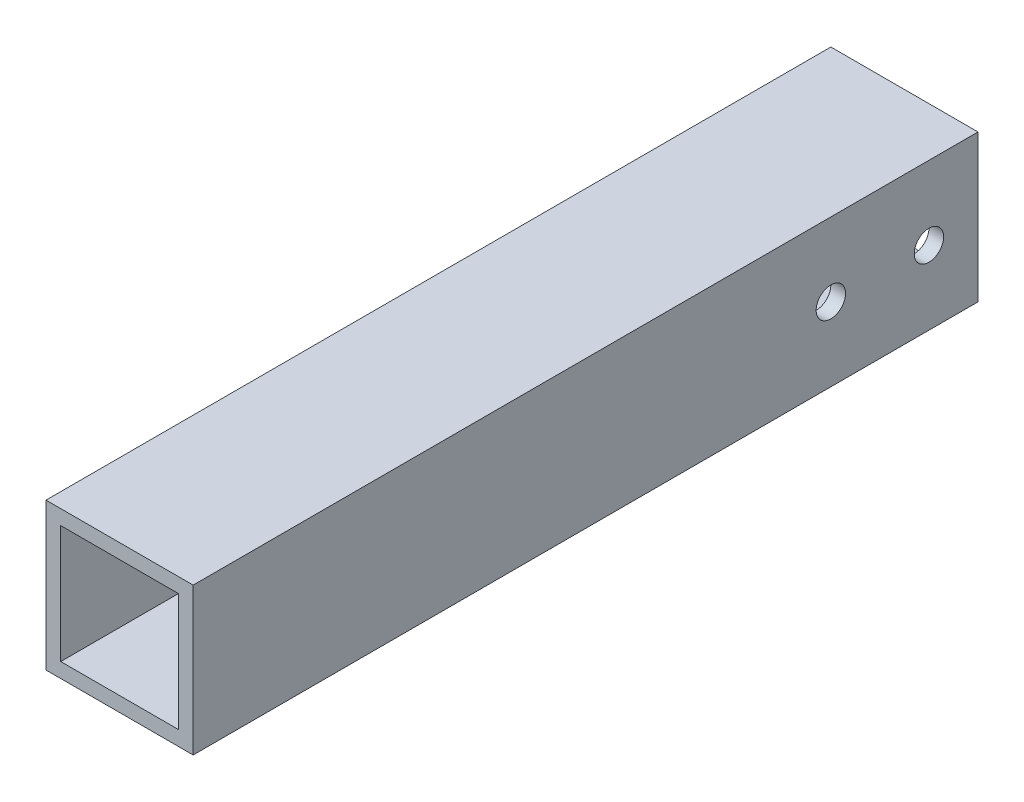
ISO-10303-21;
HEADER;
FILE_DESCRIPTION(('STEP AP214'),'2;1');
FILE_NAME('part.step','',(''),(''),'','','');
FILE_SCHEMA(('AUTOMOTIVE_DESIGN { 1 0 10303 214 1 1 1 1 }'));
ENDSEC;
DATA;
#1=APPLICATION_CONTEXT('core data for automotive mechanical design processes');
#2=APPLICATION_PROTOCOL_DEFINITION('international standard','automotive_design',2000,#1);
#3=PRODUCT_CONTEXT('',#1,'mechanical');
#4=PRODUCT('Part','Part','',(#3));
#5=PRODUCT_RELATED_PRODUCT_CATEGORY('part','',(#4));
#6=PRODUCT_DEFINITION_FORMATION('','',#4);
#7=PRODUCT_DEFINITION_CONTEXT('part definition',#1,'design');
#8=PRODUCT_DEFINITION('design','',#6,#7);
#9=PRODUCT_DEFINITION_SHAPE('','',#8);
#10=(LENGTH_UNIT() NAMED_UNIT(*) SI_UNIT(.MILLI.,.METRE.));
#11=(NAMED_UNIT(*) PLANE_ANGLE_UNIT() SI_UNIT($,.RADIAN.));
#12=(NAMED_UNIT(*) SI_UNIT($,.STERADIAN.) SOLID_ANGLE_UNIT());
#13=UNCERTAINTY_MEASURE_WITH_UNIT(LENGTH_MEASURE(1.E-05),#10,'distance_accuracy_value','');
#14=(GEOMETRIC_REPRESENTATION_CONTEXT(3) GLOBAL_UNCERTAINTY_ASSIGNED_CONTEXT((#13)) GLOBAL_UNIT_ASSIGNED_CONTEXT((#10,
#11,#12)) REPRESENTATION_CONTEXT('',''));
#15=CARTESIAN_POINT('',(0.,0.,0.));
#16=DIRECTION('',(0.,0.,1.));
#17=DIRECTION('',(1.,0.,0.));
#18=AXIS2_PLACEMENT_3D('',#15,#16,#17);
#19=CARTESIAN_POINT('',(7.5,-7.49999999999999,80.));
#20=DIRECTION('',(-1.,0.,0.));
#21=DIRECTION('',(0.,0.,1.));
#22=AXIS2_PLACEMENT_3D('',#19,#20,#21);
#23=PLANE('',#22);
#24=CARTESIAN_POINT('',(7.5,0.,15.));
#25=DIRECTION('',(1.,0.,0.));
#26=DIRECTION('',(0.,0.,-1.));
#27=AXIS2_PLACEMENT_3D('',#24,#25,#26);
#28=CIRCLE('',#27,1.5);
#29=CARTESIAN_POINT('',(7.5,0.,13.5));
#30=VERTEX_POINT('',#29);
#31=EDGE_CURVE('E176',#30,#30,#28,.T.);
#32=ORIENTED_EDGE('',*,*,#31,.F.);
#33=EDGE_LOOP('',(#32));
#34=FACE_BOUND('',#33,.T.);
#35=CARTESIAN_POINT('',(7.5,0.,4.99999999999999));
#36=DIRECTION('',(1.,0.,0.));
#37=DIRECTION('',(0.,0.,-1.));
#38=AXIS2_PLACEMENT_3D('',#35,#36,#37);
#39=CIRCLE('',#38,1.5);
#40=CARTESIAN_POINT('',(7.5,0.,3.49999999999999));
#41=VERTEX_POINT('',#40);
#42=EDGE_CURVE('E167',#41,#41,#39,.T.);
#43=ORIENTED_EDGE('',*,*,#42,.F.);
#44=EDGE_LOOP('',(#43));
#45=FACE_BOUND('',#44,.T.);
#46=DIRECTION('',(0.,1.,0.));
#47=VECTOR('',#46,1.);
#48=CARTESIAN_POINT('',(7.5,-7.49999999999999,0.));
#49=LINE('',#48,#47);
#50=CARTESIAN_POINT('',(7.5,-7.49999999999999,0.));
#51=VERTEX_POINT('',#50);
#52=CARTESIAN_POINT('',(7.5,7.50000000000001,0.));
#53=VERTEX_POINT('',#52);
#54=EDGE_CURVE('E132',#51,#53,#49,.T.);
#55=ORIENTED_EDGE('',*,*,#54,.T.);
#56=DIRECTION('',(0.,0.,-1.));
#57=VECTOR('',#56,1.);
#58=CARTESIAN_POINT('',(7.5,7.50000000000001,80.));
#59=LINE('',#58,#57);
#60=CARTESIAN_POINT('',(7.5,7.50000000000001,80.));
#61=VERTEX_POINT('',#60);
#62=EDGE_CURVE('E11',#61,#53,#59,.T.);
#63=ORIENTED_EDGE('',*,*,#62,.F.);
#64=DIRECTION('',(0.,1.,0.));
#65=VECTOR('',#64,1.);
#66=CARTESIAN_POINT('',(7.5,-7.49999999999999,80.));
#67=LINE('',#66,#65);
#68=CARTESIAN_POINT('',(7.5,-7.49999999999999,80.));
#69=VERTEX_POINT('',#68);
#70=EDGE_CURVE('E136',#69,#61,#67,.T.);
#71=ORIENTED_EDGE('',*,*,#70,.F.);
#72=DIRECTION('',(0.,0.,-1.));
#73=VECTOR('',#72,1.);
#74=CARTESIAN_POINT('',(7.5,-7.49999999999999,80.));
#75=LINE('',#74,#73);
#76=EDGE_CURVE('E146',#69,#51,#75,.T.);
#77=ORIENTED_EDGE('',*,*,#76,.T.);
#78=EDGE_LOOP('',(#55,#63,#71,#77));
#79=FACE_BOUND('',#78,.T.);
#80=ADVANCED_FACE('F30',(#34,#45,#79),#23,.F.);
#81=CARTESIAN_POINT('',(-7.5,7.50000000000001,80.));
#82=DIRECTION('',(0.,-1.,0.));
#83=DIRECTION('',(0.,0.,-1.));
#84=AXIS2_PLACEMENT_3D('',#81,#82,#83);
#85=PLANE('',#84);
#86=DIRECTION('',(-1.,0.,0.));
#87=VECTOR('',#86,1.);
#88=CARTESIAN_POINT('',(-7.5,7.50000000000001,0.));
#89=LINE('',#88,#87);
#90=CARTESIAN_POINT('',(-7.5,7.50000000000001,0.));
#91=VERTEX_POINT('',#90);
#92=EDGE_CURVE('E149',#53,#91,#89,.T.);
#93=ORIENTED_EDGE('',*,*,#92,.T.);
#94=DIRECTION('',(0.,0.,-1.));
#95=VECTOR('',#94,1.);
#96=CARTESIAN_POINT('',(-7.5,7.50000000000001,80.));
#97=LINE('',#96,#95);
#98=CARTESIAN_POINT('',(-7.5,7.50000000000001,80.));
#99=VERTEX_POINT('',#98);
#100=EDGE_CURVE('E38',#99,#91,#97,.T.);
#101=ORIENTED_EDGE('',*,*,#100,.F.);
#102=DIRECTION('',(-1.,0.,0.));
#103=VECTOR('',#102,1.);
#104=CARTESIAN_POINT('',(-7.5,7.50000000000001,80.));
#105=LINE('',#104,#103);
#106=EDGE_CURVE('E139',#61,#99,#105,.T.);
#107=ORIENTED_EDGE('',*,*,#106,.F.);
#108=ORIENTED_EDGE('',*,*,#62,.T.);
#109=EDGE_LOOP('',(#93,#101,#107,#108));
#110=FACE_BOUND('',#109,.T.);
#111=ADVANCED_FACE('F203',(#110),#85,.F.);
#112=CARTESIAN_POINT('',(-7.5,-7.49999999999999,80.));
#113=DIRECTION('',(1.,0.,0.));
#114=DIRECTION('',(0.,0.,-1.));
#115=AXIS2_PLACEMENT_3D('',#112,#113,#114);
#116=PLANE('',#115);
#117=CARTESIAN_POINT('',(-7.5,0.,15.));
#118=DIRECTION('',(1.,0.,0.));
#119=DIRECTION('',(0.,0.,-1.));
#120=AXIS2_PLACEMENT_3D('',#117,#118,#119);
#121=CIRCLE('',#120,1.5);
#122=CARTESIAN_POINT('',(-7.5,0.,13.5));
#123=VERTEX_POINT('',#122);
#124=EDGE_CURVE('E179',#123,#123,#121,.T.);
#125=ORIENTED_EDGE('',*,*,#124,.T.);
#126=EDGE_LOOP('',(#125));
#127=FACE_BOUND('',#126,.T.);
#128=CARTESIAN_POINT('',(-7.5,0.,4.99999999999999));
#129=DIRECTION('',(1.,0.,0.));
#130=DIRECTION('',(0.,0.,-1.));
#131=AXIS2_PLACEMENT_3D('',#128,#129,#130);
#132=CIRCLE('',#131,1.5);
#133=CARTESIAN_POINT('',(-7.5,0.,3.49999999999999));
#134=VERTEX_POINT('',#133);
#135=EDGE_CURVE('E162',#134,#134,#132,.T.);
#136=ORIENTED_EDGE('',*,*,#135,.T.);
#137=EDGE_LOOP('',(#136));
#138=FACE_BOUND('',#137,.T.);
#139=DIRECTION('',(0.,-1.,0.));
#140=VECTOR('',#139,1.);
#141=CARTESIAN_POINT('',(-7.5,-7.49999999999999,0.));
#142=LINE('',#141,#140);
#143=CARTESIAN_POINT('',(-7.5,-7.49999999999999,0.));
#144=VERTEX_POINT('',#143);
#145=EDGE_CURVE('E151',#91,#144,#142,.T.);
#146=ORIENTED_EDGE('',*,*,#145,.T.);
#147=DIRECTION('',(0.,0.,-1.));
#148=VECTOR('',#147,1.);
#149=CARTESIAN_POINT('',(-7.5,-7.49999999999999,80.));
#150=LINE('',#149,#148);
#151=CARTESIAN_POINT('',(-7.5,-7.49999999999999,80.));
#152=VERTEX_POINT('',#151);
#153=EDGE_CURVE('E156',#152,#144,#150,.T.);
#154=ORIENTED_EDGE('',*,*,#153,.F.);
#155=DIRECTION('',(0.,-1.,0.));
#156=VECTOR('',#155,1.);
#157=CARTESIAN_POINT('',(-7.5,-7.49999999999999,80.));
#158=LINE('',#157,#156);
#159=EDGE_CURVE('E142',#99,#152,#158,.T.);
#160=ORIENTED_EDGE('',*,*,#159,.F.);
#161=ORIENTED_EDGE('',*,*,#100,.T.);
#162=EDGE_LOOP('',(#146,#154,#160,#161));
#163=FACE_BOUND('',#162,.T.);
#164=ADVANCED_FACE('F208',(#127,#138,#163),#116,.F.);
#165=CARTESIAN_POINT('',(-7.5,-7.49999999999999,80.));
#166=DIRECTION('',(0.,1.,0.));
#167=DIRECTION('',(0.,0.,1.));
#168=AXIS2_PLACEMENT_3D('',#165,#166,#167);
#169=PLANE('',#168);
#170=DIRECTION('',(1.,0.,0.));
#171=VECTOR('',#170,1.);
#172=CARTESIAN_POINT('',(-7.5,-7.49999999999999,0.));
#173=LINE('',#172,#171);
#174=EDGE_CURVE('E140',#144,#51,#173,.T.);
#175=ORIENTED_EDGE('',*,*,#174,.T.);
#176=ORIENTED_EDGE('',*,*,#76,.F.);
#177=DIRECTION('',(1.,0.,0.));
#178=VECTOR('',#177,1.);
#179=CARTESIAN_POINT('',(-7.5,-7.49999999999999,80.));
#180=LINE('',#179,#178);
#181=EDGE_CURVE('E144',#152,#69,#180,.T.);
#182=ORIENTED_EDGE('',*,*,#181,.F.);
#183=ORIENTED_EDGE('',*,*,#153,.T.);
#184=EDGE_LOOP('',(#175,#176,#182,#183));
#185=FACE_BOUND('',#184,.T.);
#186=ADVANCED_FACE('F227',(#185),#169,.F.);
#187=CARTESIAN_POINT('',(7.5,7.50000000000001,80.));
#188=DIRECTION('',(0.,0.,-1.));
#189=DIRECTION('',(-1.,0.,0.));
#190=AXIS2_PLACEMENT_3D('',#187,#188,#189);
#191=PLANE('',#190);
#192=DIRECTION('',(-1.,0.,0.));
#193=VECTOR('',#192,1.);
#194=CARTESIAN_POINT('',(-6.,6.00000000000001,80.));
#195=LINE('',#194,#193);
#196=CARTESIAN_POINT('',(6.,6.00000000000001,80.));
#197=VERTEX_POINT('',#196);
#198=CARTESIAN_POINT('',(-6.,6.00000000000001,80.));
#199=VERTEX_POINT('',#198);
#200=EDGE_CURVE('E126',#197,#199,#195,.T.);
#201=ORIENTED_EDGE('',*,*,#200,.F.);
#202=DIRECTION('',(0.,1.,0.));
#203=VECTOR('',#202,1.);
#204=CARTESIAN_POINT('',(6.,-6.00000000000001,80.));
#205=LINE('',#204,#203);
#206=CARTESIAN_POINT('',(6.,-6.00000000000001,80.));
#207=VERTEX_POINT('',#206);
#208=EDGE_CURVE('E46',#207,#197,#205,.T.);
#209=ORIENTED_EDGE('',*,*,#208,.F.);
#210=DIRECTION('',(1.,0.,0.));
#211=VECTOR('',#210,1.);
#212=CARTESIAN_POINT('',(-6.,-6.00000000000001,80.));
#213=LINE('',#212,#211);
#214=CARTESIAN_POINT('',(-6.,-6.00000000000001,80.));
#215=VERTEX_POINT('',#214);
#216=EDGE_CURVE('E114',#215,#207,#213,.T.);
#217=ORIENTED_EDGE('',*,*,#216,.F.);
#218=DIRECTION('',(0.,-1.,0.));
#219=VECTOR('',#218,1.);
#220=CARTESIAN_POINT('',(-6.,-6.00000000000001,80.));
#221=LINE('',#220,#219);
#222=EDGE_CURVE('E117',#199,#215,#221,.T.);
#223=ORIENTED_EDGE('',*,*,#222,.F.);
#224=EDGE_LOOP('',(#201,#209,#217,#223));
#225=FACE_BOUND('',#224,.T.);
#226=ORIENTED_EDGE('',*,*,#70,.T.);
#227=ORIENTED_EDGE('',*,*,#106,.T.);
#228=ORIENTED_EDGE('',*,*,#159,.T.);
#229=ORIENTED_EDGE('',*,*,#181,.T.);
#230=EDGE_LOOP('',(#226,#227,#228,#229));
#231=FACE_BOUND('',#230,.T.);
#232=ADVANCED_FACE('F223',(#225,#231),#191,.F.);
#233=CARTESIAN_POINT('',(7.5,7.50000000000001,0.));
#234=DIRECTION('',(0.,0.,-1.));
#235=DIRECTION('',(-1.,0.,0.));
#236=AXIS2_PLACEMENT_3D('',#233,#234,#235);
#237=PLANE('',#236);
#238=DIRECTION('',(0.,1.,0.));
#239=VECTOR('',#238,1.);
#240=CARTESIAN_POINT('',(6.,-6.00000000000001,0.));
#241=LINE('',#240,#239);
#242=CARTESIAN_POINT('',(6.,-6.00000000000001,0.));
#243=VERTEX_POINT('',#242);
#244=CARTESIAN_POINT('',(6.,6.00000000000001,0.));
#245=VERTEX_POINT('',#244);
#246=EDGE_CURVE('E98',#243,#245,#241,.T.);
#247=ORIENTED_EDGE('',*,*,#246,.T.);
#248=DIRECTION('',(-1.,0.,0.));
#249=VECTOR('',#248,1.);
#250=CARTESIAN_POINT('',(-6.,6.00000000000001,0.));
#251=LINE('',#250,#249);
#252=CARTESIAN_POINT('',(-6.,6.00000000000001,0.));
#253=VERTEX_POINT('',#252);
#254=EDGE_CURVE('E107',#245,#253,#251,.T.);
#255=ORIENTED_EDGE('',*,*,#254,.T.);
#256=DIRECTION('',(0.,-1.,0.));
#257=VECTOR('',#256,1.);
#258=CARTESIAN_POINT('',(-6.,-6.00000000000001,0.));
#259=LINE('',#258,#257);
#260=CARTESIAN_POINT('',(-6.,-6.00000000000001,0.));
#261=VERTEX_POINT('',#260);
#262=EDGE_CURVE('E54',#253,#261,#259,.T.);
#263=ORIENTED_EDGE('',*,*,#262,.T.);
#264=DIRECTION('',(1.,0.,0.));
#265=VECTOR('',#264,1.);
#266=CARTESIAN_POINT('',(-6.,-6.00000000000001,0.));
#267=LINE('',#266,#265);
#268=EDGE_CURVE('E104',#261,#243,#267,.T.);
#269=ORIENTED_EDGE('',*,*,#268,.T.);
#270=EDGE_LOOP('',(#247,#255,#263,#269));
#271=FACE_BOUND('',#270,.T.);
#272=ORIENTED_EDGE('',*,*,#54,.F.);
#273=ORIENTED_EDGE('',*,*,#174,.F.);
#274=ORIENTED_EDGE('',*,*,#145,.F.);
#275=ORIENTED_EDGE('',*,*,#92,.F.);
#276=EDGE_LOOP('',(#272,#273,#274,#275));
#277=FACE_BOUND('',#276,.T.);
#278=ADVANCED_FACE('F111',(#271,#277),#237,.T.);
#279=CARTESIAN_POINT('',(6.,-6.00000000000001,0.));
#280=DIRECTION('',(1.,0.,0.));
#281=DIRECTION('',(0.,0.,-1.));
#282=AXIS2_PLACEMENT_3D('',#279,#280,#281);
#283=PLANE('',#282);
#284=CARTESIAN_POINT('',(6.,0.,15.));
#285=DIRECTION('',(1.,0.,0.));
#286=DIRECTION('',(0.,0.,-1.));
#287=AXIS2_PLACEMENT_3D('',#284,#285,#286);
#288=CIRCLE('',#287,1.5);
#289=CARTESIAN_POINT('',(6.,0.,13.5));
#290=VERTEX_POINT('',#289);
#291=EDGE_CURVE('E172',#290,#290,#288,.T.);
#292=ORIENTED_EDGE('',*,*,#291,.T.);
#293=EDGE_LOOP('',(#292));
#294=FACE_BOUND('',#293,.T.);
#295=CARTESIAN_POINT('',(6.,0.,4.99999999999999));
#296=DIRECTION('',(1.,0.,0.));
#297=DIRECTION('',(0.,0.,-1.));
#298=AXIS2_PLACEMENT_3D('',#295,#296,#297);
#299=CIRCLE('',#298,1.5);
#300=CARTESIAN_POINT('',(6.,0.,3.49999999999999));
#301=VERTEX_POINT('',#300);
#302=EDGE_CURVE('E120',#301,#301,#299,.T.);
#303=ORIENTED_EDGE('',*,*,#302,.T.);
#304=EDGE_LOOP('',(#303));
#305=FACE_BOUND('',#304,.T.);
#306=ORIENTED_EDGE('',*,*,#208,.T.);
#307=DIRECTION('',(0.,0.,1.));
#308=VECTOR('',#307,1.);
#309=CARTESIAN_POINT('',(6.,6.00000000000001,0.));
#310=LINE('',#309,#308);
#311=EDGE_CURVE('E94',#245,#197,#310,.T.);
#312=ORIENTED_EDGE('',*,*,#311,.F.);
#313=ORIENTED_EDGE('',*,*,#246,.F.);
#314=DIRECTION('',(0.,0.,1.));
#315=VECTOR('',#314,1.);
#316=CARTESIAN_POINT('',(6.,-6.00000000000001,0.));
#317=LINE('',#316,#315);
#318=EDGE_CURVE('E130',#243,#207,#317,.T.);
#319=ORIENTED_EDGE('',*,*,#318,.T.);
#320=EDGE_LOOP('',(#306,#312,#313,#319));
#321=FACE_BOUND('',#320,.T.);
#322=ADVANCED_FACE('F96',(#294,#305,#321),#283,.F.);
#323=CARTESIAN_POINT('',(-6.,-6.00000000000001,0.));
#324=DIRECTION('',(0.,-1.,0.));
#325=DIRECTION('',(0.,0.,-1.));
#326=AXIS2_PLACEMENT_3D('',#323,#324,#325);
#327=PLANE('',#326);
#328=ORIENTED_EDGE('',*,*,#216,.T.);
#329=ORIENTED_EDGE('',*,*,#318,.F.);
#330=ORIENTED_EDGE('',*,*,#268,.F.);
#331=DIRECTION('',(0.,0.,1.));
#332=VECTOR('',#331,1.);
#333=CARTESIAN_POINT('',(-6.,-6.00000000000001,0.));
#334=LINE('',#333,#332);
#335=EDGE_CURVE('E133',#261,#215,#334,.T.);
#336=ORIENTED_EDGE('',*,*,#335,.T.);
#337=EDGE_LOOP('',(#328,#329,#330,#336));
#338=FACE_BOUND('',#337,.T.);
#339=ADVANCED_FACE('F243',(#338),#327,.F.);
#340=CARTESIAN_POINT('',(-6.,-6.00000000000001,0.));
#341=DIRECTION('',(-1.,0.,0.));
#342=DIRECTION('',(0.,0.,1.));
#343=AXIS2_PLACEMENT_3D('',#340,#341,#342);
#344=PLANE('',#343);
#345=CARTESIAN_POINT('',(-6.,0.,15.));
#346=DIRECTION('',(-1.,0.,0.));
#347=DIRECTION('',(0.,0.,1.));
#348=AXIS2_PLACEMENT_3D('',#345,#346,#347);
#349=CIRCLE('',#348,1.5);
#350=CARTESIAN_POINT('',(-6.,0.,16.5));
#351=VERTEX_POINT('',#350);
#352=EDGE_CURVE('E33',#351,#351,#349,.T.);
#353=ORIENTED_EDGE('',*,*,#352,.T.);
#354=EDGE_LOOP('',(#353));
#355=FACE_BOUND('',#354,.T.);
#356=CARTESIAN_POINT('',(-6.,0.,4.99999999999999));
#357=DIRECTION('',(-1.,0.,0.));
#358=DIRECTION('',(0.,0.,1.));
#359=AXIS2_PLACEMENT_3D('',#356,#357,#358);
#360=CIRCLE('',#359,1.5);
#361=CARTESIAN_POINT('',(-6.,0.,6.49999999999999));
#362=VERTEX_POINT('',#361);
#363=EDGE_CURVE('E160',#362,#362,#360,.T.);
#364=ORIENTED_EDGE('',*,*,#363,.T.);
#365=EDGE_LOOP('',(#364));
#366=FACE_BOUND('',#365,.T.);
#367=ORIENTED_EDGE('',*,*,#222,.T.);
#368=ORIENTED_EDGE('',*,*,#335,.F.);
#369=ORIENTED_EDGE('',*,*,#262,.F.);
#370=DIRECTION('',(0.,0.,1.));
#371=VECTOR('',#370,1.);
#372=CARTESIAN_POINT('',(-6.,6.00000000000001,0.));
#373=LINE('',#372,#371);
#374=EDGE_CURVE('E103',#253,#199,#373,.T.);
#375=ORIENTED_EDGE('',*,*,#374,.T.);
#376=EDGE_LOOP('',(#367,#368,#369,#375));
#377=FACE_BOUND('',#376,.T.);
#378=ADVANCED_FACE('F186',(#355,#366,#377),#344,.F.);
#379=CARTESIAN_POINT('',(-6.,6.00000000000001,0.));
#380=DIRECTION('',(0.,1.,0.));
#381=DIRECTION('',(0.,0.,1.));
#382=AXIS2_PLACEMENT_3D('',#379,#380,#381);
#383=PLANE('',#382);
#384=ORIENTED_EDGE('',*,*,#200,.T.);
#385=ORIENTED_EDGE('',*,*,#374,.F.);
#386=ORIENTED_EDGE('',*,*,#254,.F.);
#387=ORIENTED_EDGE('',*,*,#311,.T.);
#388=EDGE_LOOP('',(#384,#385,#386,#387));
#389=FACE_BOUND('',#388,.T.);
#390=ADVANCED_FACE('F108',(#389),#383,.F.);
#391=CARTESIAN_POINT('',(-7.5,0.,4.99999999999999));
#392=DIRECTION('',(1.,0.,0.));
#393=DIRECTION('',(0.,0.,-1.));
#394=AXIS2_PLACEMENT_3D('',#391,#392,#393);
#395=CYLINDRICAL_SURFACE('',#394,1.5);
#396=ORIENTED_EDGE('',*,*,#135,.F.);
#397=EDGE_LOOP('',(#396));
#398=FACE_BOUND('',#397,.T.);
#399=ORIENTED_EDGE('',*,*,#363,.F.);
#400=EDGE_LOOP('',(#399));
#401=FACE_BOUND('',#400,.T.);
#402=ADVANCED_FACE('F199',(#398,#401),#395,.F.);
#403=ORIENTED_EDGE('',*,*,#42,.T.);
#404=EDGE_LOOP('',(#403));
#405=FACE_BOUND('',#404,.T.);
#406=ORIENTED_EDGE('',*,*,#302,.F.);
#407=EDGE_LOOP('',(#406));
#408=FACE_BOUND('',#407,.T.);
#409=ADVANCED_FACE('F191',(#405,#408),#395,.F.);
#410=CARTESIAN_POINT('',(-7.5,0.,15.));
#411=DIRECTION('',(1.,0.,0.));
#412=DIRECTION('',(0.,0.,-1.));
#413=AXIS2_PLACEMENT_3D('',#410,#411,#412);
#414=CYLINDRICAL_SURFACE('',#413,1.5);
#415=ORIENTED_EDGE('',*,*,#124,.F.);
#416=EDGE_LOOP('',(#415));
#417=FACE_BOUND('',#416,.T.);
#418=ORIENTED_EDGE('',*,*,#352,.F.);
#419=EDGE_LOOP('',(#418));
#420=FACE_BOUND('',#419,.T.);
#421=ADVANCED_FACE('F188',(#417,#420),#414,.F.);
#422=ORIENTED_EDGE('',*,*,#31,.T.);
#423=EDGE_LOOP('',(#422));
#424=FACE_BOUND('',#423,.T.);
#425=ORIENTED_EDGE('',*,*,#291,.F.);
#426=EDGE_LOOP('',(#425));
#427=FACE_BOUND('',#426,.T.);
#428=ADVANCED_FACE('F190',(#424,#427),#414,.F.);
#429=CLOSED_SHELL('',(#80,#111,#164,#186,#232,#278,#322,#339,#378,#390,#402,#409,#421,#428));
#430=MANIFOLD_SOLID_BREP('B2',#429);
#431=ADVANCED_BREP_SHAPE_REPRESENTATION('',(#18,#430),#14);
#432=SHAPE_DEFINITION_REPRESENTATION(#9,#431);
ENDSEC;
END-ISO-10303-21;
